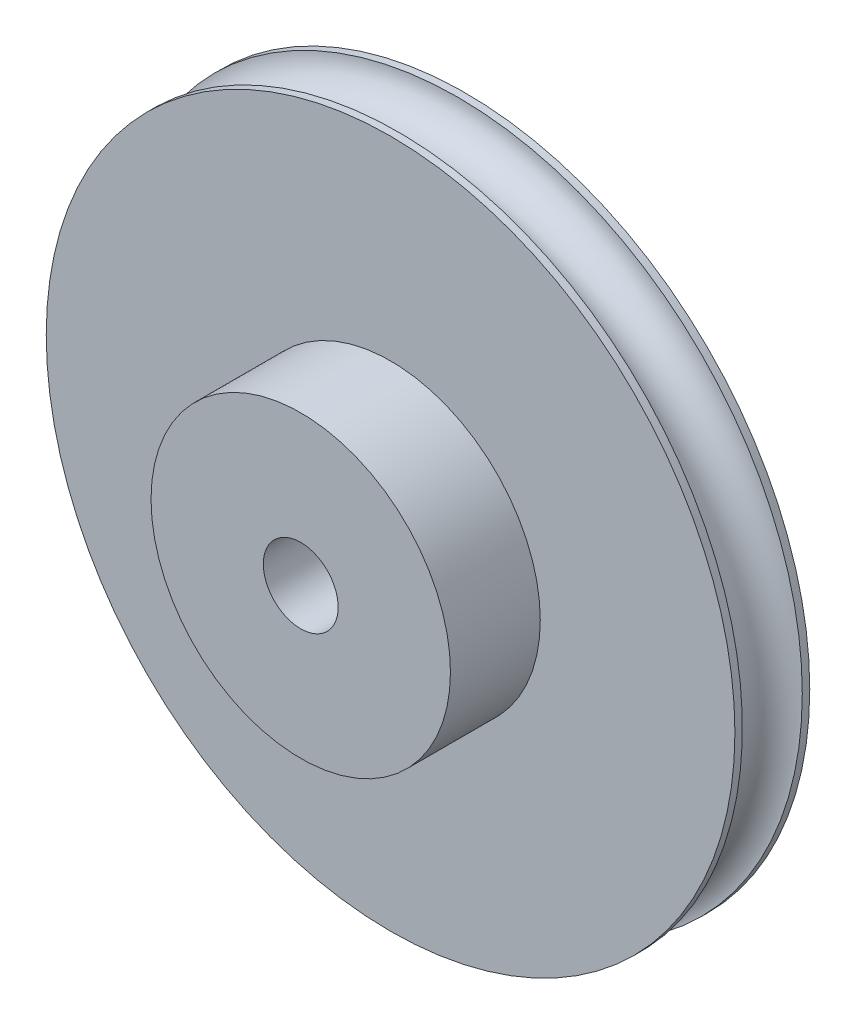
ISO-10303-21;
HEADER;
FILE_DESCRIPTION(('STEP AP214'),'2;1');
FILE_NAME('part.step','',(''),(''),'','','');
FILE_SCHEMA(('AUTOMOTIVE_DESIGN { 1 0 10303 214 1 1 1 1 }'));
ENDSEC;
DATA;
#1=APPLICATION_CONTEXT('core data for automotive mechanical design processes');
#2=APPLICATION_PROTOCOL_DEFINITION('international standard','automotive_design',2000,#1);
#3=PRODUCT_CONTEXT('',#1,'mechanical');
#4=PRODUCT('Part','Part','',(#3));
#5=PRODUCT_RELATED_PRODUCT_CATEGORY('part','',(#4));
#6=PRODUCT_DEFINITION_FORMATION('','',#4);
#7=PRODUCT_DEFINITION_CONTEXT('part definition',#1,'design');
#8=PRODUCT_DEFINITION('design','',#6,#7);
#9=PRODUCT_DEFINITION_SHAPE('','',#8);
#10=(LENGTH_UNIT() NAMED_UNIT(*) SI_UNIT(.MILLI.,.METRE.));
#11=(NAMED_UNIT(*) PLANE_ANGLE_UNIT() SI_UNIT($,.RADIAN.));
#12=(NAMED_UNIT(*) SI_UNIT($,.STERADIAN.) SOLID_ANGLE_UNIT());
#13=UNCERTAINTY_MEASURE_WITH_UNIT(LENGTH_MEASURE(1.E-05),#10,'distance_accuracy_value','');
#14=(GEOMETRIC_REPRESENTATION_CONTEXT(3) GLOBAL_UNCERTAINTY_ASSIGNED_CONTEXT((#13)) GLOBAL_UNIT_ASSIGNED_CONTEXT((#10,
#11,#12)) REPRESENTATION_CONTEXT('',''));
#15=CARTESIAN_POINT('',(0.,0.,0.));
#16=DIRECTION('',(0.,0.,1.));
#17=DIRECTION('',(1.,0.,0.));
#18=AXIS2_PLACEMENT_3D('',#15,#16,#17);
#19=CARTESIAN_POINT('',(0.,0.,5.));
#20=DIRECTION('',(0.,0.,-1.));
#21=DIRECTION('',(-1.,0.,0.));
#22=AXIS2_PLACEMENT_3D('',#19,#20,#21);
#23=CYLINDRICAL_SURFACE('',#22,23.);
#24=CARTESIAN_POINT('',(0.,0.,0.5));
#25=DIRECTION('',(0.,0.,1.));
#26=DIRECTION('',(1.,0.,0.));
#27=AXIS2_PLACEMENT_3D('',#24,#25,#26);
#28=CIRCLE('',#27,23.);
#29=CARTESIAN_POINT('',(23.,0.,0.5));
#30=VERTEX_POINT('',#29);
#31=EDGE_CURVE('E37',#30,#30,#28,.F.);
#32=ORIENTED_EDGE('',*,*,#31,.T.);
#33=EDGE_LOOP('',(#32));
#34=FACE_BOUND('',#33,.T.);
#35=CARTESIAN_POINT('',(0.,0.,0.));
#36=DIRECTION('',(0.,0.,1.));
#37=DIRECTION('',(1.,0.,0.));
#38=AXIS2_PLACEMENT_3D('',#35,#36,#37);
#39=CIRCLE('',#38,23.);
#40=CARTESIAN_POINT('',(23.,0.,0.));
#41=VERTEX_POINT('',#40);
#42=EDGE_CURVE('E46',#41,#41,#39,.T.);
#43=ORIENTED_EDGE('',*,*,#42,.T.);
#44=EDGE_LOOP('',(#43));
#45=FACE_BOUND('',#44,.T.);
#46=ADVANCED_FACE('F33',(#34,#45),#23,.T.);
#47=CARTESIAN_POINT('',(0.,0.,4.5));
#48=DIRECTION('',(0.,0.,-1.));
#49=DIRECTION('',(-1.,0.,0.));
#50=AXIS2_PLACEMENT_3D('',#47,#48,#49);
#51=CIRCLE('',#50,23.);
#52=CARTESIAN_POINT('',(-23.,0.,4.5));
#53=VERTEX_POINT('',#52);
#54=EDGE_CURVE('E53',#53,#53,#51,.F.);
#55=ORIENTED_EDGE('',*,*,#54,.T.);
#56=EDGE_LOOP('',(#55));
#57=FACE_BOUND('',#56,.T.);
#58=CARTESIAN_POINT('',(0.,0.,5.));
#59=DIRECTION('',(0.,0.,1.));
#60=DIRECTION('',(1.,0.,0.));
#61=AXIS2_PLACEMENT_3D('',#58,#59,#60);
#62=CIRCLE('',#61,23.);
#63=CARTESIAN_POINT('',(23.,0.,5.));
#64=VERTEX_POINT('',#63);
#65=EDGE_CURVE('E41',#64,#64,#62,.T.);
#66=ORIENTED_EDGE('',*,*,#65,.F.);
#67=EDGE_LOOP('',(#66));
#68=FACE_BOUND('',#67,.T.);
#69=ADVANCED_FACE('F35',(#57,#68),#23,.T.);
#70=CARTESIAN_POINT('',(0.,0.,5.));
#71=DIRECTION('',(0.,0.,1.));
#72=DIRECTION('',(1.,0.,0.));
#73=AXIS2_PLACEMENT_3D('',#70,#71,#72);
#74=PLANE('',#73);
#75=CARTESIAN_POINT('',(0.,0.,5.));
#76=DIRECTION('',(0.,0.,1.));
#77=DIRECTION('',(1.,0.,0.));
#78=AXIS2_PLACEMENT_3D('',#75,#76,#77);
#79=CIRCLE('',#78,10.);
#80=CARTESIAN_POINT('',(10.,0.,5.));
#81=VERTEX_POINT('',#80);
#82=EDGE_CURVE('E10',#81,#81,#79,.T.);
#83=ORIENTED_EDGE('',*,*,#82,.F.);
#84=EDGE_LOOP('',(#83));
#85=FACE_BOUND('',#84,.T.);
#86=ORIENTED_EDGE('',*,*,#65,.T.);
#87=EDGE_LOOP('',(#86));
#88=FACE_BOUND('',#87,.T.);
#89=ADVANCED_FACE('F85',(#85,#88),#74,.T.);
#90=CARTESIAN_POINT('',(0.,0.,0.));
#91=DIRECTION('',(0.,0.,1.));
#92=DIRECTION('',(1.,0.,0.));
#93=AXIS2_PLACEMENT_3D('',#90,#91,#92);
#94=PLANE('',#93);
#95=CARTESIAN_POINT('',(0.,0.,0.));
#96=DIRECTION('',(0.,0.,1.));
#97=DIRECTION('',(1.,0.,0.));
#98=AXIS2_PLACEMENT_3D('',#95,#96,#97);
#99=CIRCLE('',#98,2.5);
#100=CARTESIAN_POINT('',(2.5,0.,0.));
#101=VERTEX_POINT('',#100);
#102=EDGE_CURVE('E62',#101,#101,#99,.T.);
#103=ORIENTED_EDGE('',*,*,#102,.T.);
#104=EDGE_LOOP('',(#103));
#105=FACE_BOUND('',#104,.T.);
#106=ORIENTED_EDGE('',*,*,#42,.F.);
#107=EDGE_LOOP('',(#106));
#108=FACE_BOUND('',#107,.T.);
#109=ADVANCED_FACE('F76',(#105,#108),#94,.F.);
#110=CARTESIAN_POINT('',(0.,0.,11.));
#111=DIRECTION('',(0.,0.,-1.));
#112=DIRECTION('',(-1.,0.,0.));
#113=AXIS2_PLACEMENT_3D('',#110,#111,#112);
#114=CYLINDRICAL_SURFACE('',#113,10.);
#115=CARTESIAN_POINT('',(0.,0.,11.));
#116=DIRECTION('',(0.,0.,1.));
#117=DIRECTION('',(1.,0.,0.));
#118=AXIS2_PLACEMENT_3D('',#115,#116,#117);
#119=CIRCLE('',#118,10.);
#120=CARTESIAN_POINT('',(10.,0.,11.));
#121=VERTEX_POINT('',#120);
#122=EDGE_CURVE('E49',#121,#121,#119,.T.);
#123=ORIENTED_EDGE('',*,*,#122,.F.);
#124=EDGE_LOOP('',(#123));
#125=FACE_BOUND('',#124,.T.);
#126=ORIENTED_EDGE('',*,*,#82,.T.);
#127=EDGE_LOOP('',(#126));
#128=FACE_BOUND('',#127,.T.);
#129=ADVANCED_FACE('F74',(#125,#128),#114,.T.);
#130=CARTESIAN_POINT('',(0.,0.,11.));
#131=DIRECTION('',(0.,0.,1.));
#132=DIRECTION('',(1.,0.,0.));
#133=AXIS2_PLACEMENT_3D('',#130,#131,#132);
#134=PLANE('',#133);
#135=CARTESIAN_POINT('',(0.,0.,11.));
#136=DIRECTION('',(0.,0.,1.));
#137=DIRECTION('',(1.,0.,0.));
#138=AXIS2_PLACEMENT_3D('',#135,#136,#137);
#139=CIRCLE('',#138,2.5);
#140=CARTESIAN_POINT('',(2.5,0.,11.));
#141=VERTEX_POINT('',#140);
#142=EDGE_CURVE('E58',#141,#141,#139,.T.);
#143=ORIENTED_EDGE('',*,*,#142,.F.);
#144=EDGE_LOOP('',(#143));
#145=FACE_BOUND('',#144,.T.);
#146=ORIENTED_EDGE('',*,*,#122,.T.);
#147=EDGE_LOOP('',(#146));
#148=FACE_BOUND('',#147,.T.);
#149=ADVANCED_FACE('F72',(#145,#148),#134,.T.);
#150=CARTESIAN_POINT('',(0.,0.,0.));
#151=DIRECTION('',(0.,0.,1.));
#152=DIRECTION('',(1.,0.,0.));
#153=AXIS2_PLACEMENT_3D('',#150,#151,#152);
#154=CYLINDRICAL_SURFACE('',#153,2.5);
#155=ORIENTED_EDGE('',*,*,#102,.F.);
#156=EDGE_LOOP('',(#155));
#157=FACE_BOUND('',#156,.T.);
#158=ORIENTED_EDGE('',*,*,#142,.T.);
#159=EDGE_LOOP('',(#158));
#160=FACE_BOUND('',#159,.T.);
#161=ADVANCED_FACE('F82',(#157,#160),#154,.F.);
#162=CARTESIAN_POINT('',(0.,0.,2.5));
#163=DIRECTION('',(0.,0.,-1.));
#164=DIRECTION('',(-1.,0.,0.));
#165=AXIS2_PLACEMENT_3D('',#162,#163,#164);
#166=TOROIDAL_SURFACE('',#165,23.,2.);
#167=ORIENTED_EDGE('',*,*,#54,.F.);
#168=EDGE_LOOP('',(#167));
#169=FACE_BOUND('',#168,.T.);
#170=ORIENTED_EDGE('',*,*,#31,.F.);
#171=EDGE_LOOP('',(#170));
#172=FACE_BOUND('',#171,.T.);
#173=ADVANCED_FACE('F123',(#169,#172),#166,.F.);
#174=CLOSED_SHELL('',(#46,#69,#89,#109,#129,#149,#161,#173));
#175=MANIFOLD_SOLID_BREP('B2',#174);
#176=ADVANCED_BREP_SHAPE_REPRESENTATION('',(#18,#175),#14);
#177=SHAPE_DEFINITION_REPRESENTATION(#9,#176);
ENDSEC;
END-ISO-10303-21;
